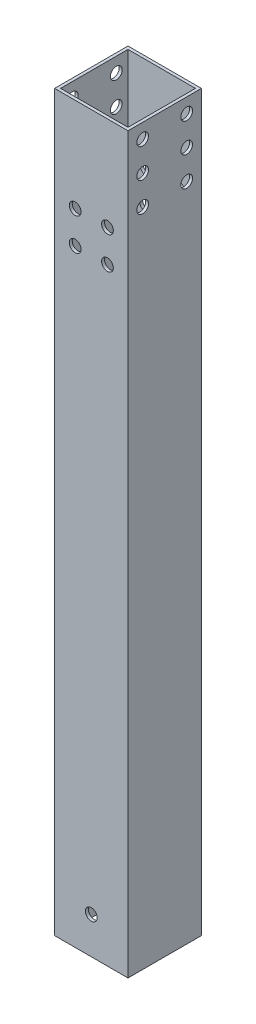
ISO-10303-21;
HEADER;
FILE_DESCRIPTION(('STEP AP214'),'2;1');
FILE_NAME('part.step','',(''),(''),'','','');
FILE_SCHEMA(('AUTOMOTIVE_DESIGN { 1 0 10303 214 1 1 1 1 }'));
ENDSEC;
DATA;
#1=APPLICATION_CONTEXT('core data for automotive mechanical design processes');
#2=APPLICATION_PROTOCOL_DEFINITION('international standard','automotive_design',2000,#1);
#3=PRODUCT_CONTEXT('',#1,'mechanical');
#4=PRODUCT('Part','Part','',(#3));
#5=PRODUCT_RELATED_PRODUCT_CATEGORY('part','',(#4));
#6=PRODUCT_DEFINITION_FORMATION('','',#4);
#7=PRODUCT_DEFINITION_CONTEXT('part definition',#1,'design');
#8=PRODUCT_DEFINITION('design','',#6,#7);
#9=PRODUCT_DEFINITION_SHAPE('','',#8);
#10=(LENGTH_UNIT() NAMED_UNIT(*) SI_UNIT(.MILLI.,.METRE.));
#11=(NAMED_UNIT(*) PLANE_ANGLE_UNIT() SI_UNIT($,.RADIAN.));
#12=(NAMED_UNIT(*) SI_UNIT($,.STERADIAN.) SOLID_ANGLE_UNIT());
#13=UNCERTAINTY_MEASURE_WITH_UNIT(LENGTH_MEASURE(1.E-05),#10,'distance_accuracy_value','');
#14=(GEOMETRIC_REPRESENTATION_CONTEXT(3) GLOBAL_UNCERTAINTY_ASSIGNED_CONTEXT((#13)) GLOBAL_UNIT_ASSIGNED_CONTEXT((#10,
#11,#12)) REPRESENTATION_CONTEXT('',''));
#15=CARTESIAN_POINT('',(0.,0.,0.));
#16=DIRECTION('',(0.,0.,1.));
#17=DIRECTION('',(1.,0.,0.));
#18=AXIS2_PLACEMENT_3D('',#15,#16,#17);
#19=CARTESIAN_POINT('',(0.,250.,0.));
#20=DIRECTION('',(0.,1.,0.));
#21=DIRECTION('',(0.,0.,1.));
#22=AXIS2_PLACEMENT_3D('',#19,#20,#21);
#23=PLANE('',#22);
#24=DIRECTION('',(0.,0.,-1.));
#25=VECTOR('',#24,1.);
#26=CARTESIAN_POINT('',(12.5,250.,-12.5));
#27=LINE('',#26,#25);
#28=CARTESIAN_POINT('',(12.5,250.,12.5));
#29=VERTEX_POINT('',#28);
#30=CARTESIAN_POINT('',(12.5,250.,-12.5));
#31=VERTEX_POINT('',#30);
#32=EDGE_CURVE('E138',#29,#31,#27,.T.);
#33=ORIENTED_EDGE('',*,*,#32,.T.);
#34=DIRECTION('',(-1.,0.,0.));
#35=VECTOR('',#34,1.);
#36=CARTESIAN_POINT('',(-12.5,250.,-12.5));
#37=LINE('',#36,#35);
#38=CARTESIAN_POINT('',(-12.5,250.,-12.5));
#39=VERTEX_POINT('',#38);
#40=EDGE_CURVE('E141',#31,#39,#37,.T.);
#41=ORIENTED_EDGE('',*,*,#40,.T.);
#42=DIRECTION('',(0.,0.,1.));
#43=VECTOR('',#42,1.);
#44=CARTESIAN_POINT('',(-12.5,250.,-12.5));
#45=LINE('',#44,#43);
#46=CARTESIAN_POINT('',(-12.5,250.,12.5));
#47=VERTEX_POINT('',#46);
#48=EDGE_CURVE('E144',#39,#47,#45,.T.);
#49=ORIENTED_EDGE('',*,*,#48,.T.);
#50=DIRECTION('',(1.,0.,0.));
#51=VECTOR('',#50,1.);
#52=CARTESIAN_POINT('',(-12.5,250.,12.5));
#53=LINE('',#52,#51);
#54=EDGE_CURVE('E146',#47,#29,#53,.T.);
#55=ORIENTED_EDGE('',*,*,#54,.T.);
#56=EDGE_LOOP('',(#33,#41,#49,#55));
#57=FACE_BOUND('',#56,.T.);
#58=DIRECTION('',(1.,0.,0.));
#59=VECTOR('',#58,1.);
#60=CARTESIAN_POINT('',(-11.5,250.,11.5));
#61=LINE('',#60,#59);
#62=CARTESIAN_POINT('',(-11.5,250.,11.5));
#63=VERTEX_POINT('',#62);
#64=CARTESIAN_POINT('',(11.5,250.,11.5));
#65=VERTEX_POINT('',#64);
#66=EDGE_CURVE('E108',#63,#65,#61,.T.);
#67=ORIENTED_EDGE('',*,*,#66,.F.);
#68=DIRECTION('',(0.,0.,1.));
#69=VECTOR('',#68,1.);
#70=CARTESIAN_POINT('',(-11.5,250.,-11.5));
#71=LINE('',#70,#69);
#72=CARTESIAN_POINT('',(-11.5,250.,-11.5));
#73=VERTEX_POINT('',#72);
#74=EDGE_CURVE('E100',#73,#63,#71,.T.);
#75=ORIENTED_EDGE('',*,*,#74,.F.);
#76=DIRECTION('',(-1.,0.,0.));
#77=VECTOR('',#76,1.);
#78=CARTESIAN_POINT('',(-11.5,250.,-11.5));
#79=LINE('',#78,#77);
#80=CARTESIAN_POINT('',(11.5,250.,-11.5));
#81=VERTEX_POINT('',#80);
#82=EDGE_CURVE('E122',#81,#73,#79,.T.);
#83=ORIENTED_EDGE('',*,*,#82,.F.);
#84=DIRECTION('',(0.,0.,-1.));
#85=VECTOR('',#84,1.);
#86=CARTESIAN_POINT('',(11.5,250.,-11.5));
#87=LINE('',#86,#85);
#88=EDGE_CURVE('E120',#65,#81,#87,.T.);
#89=ORIENTED_EDGE('',*,*,#88,.F.);
#90=EDGE_LOOP('',(#67,#75,#83,#89));
#91=FACE_BOUND('',#90,.T.);
#92=ADVANCED_FACE('F33',(#57,#91),#23,.T.);
#93=CARTESIAN_POINT('',(0.,0.,0.));
#94=DIRECTION('',(0.,1.,0.));
#95=DIRECTION('',(0.,0.,1.));
#96=AXIS2_PLACEMENT_3D('',#93,#94,#95);
#97=PLANE('',#96);
#98=DIRECTION('',(0.,0.,-1.));
#99=VECTOR('',#98,1.);
#100=CARTESIAN_POINT('',(12.5,0.,-12.5));
#101=LINE('',#100,#99);
#102=CARTESIAN_POINT('',(12.5,0.,12.5));
#103=VERTEX_POINT('',#102);
#104=CARTESIAN_POINT('',(12.5,0.,-12.5));
#105=VERTEX_POINT('',#104);
#106=EDGE_CURVE('E116',#103,#105,#101,.T.);
#107=ORIENTED_EDGE('',*,*,#106,.F.);
#108=DIRECTION('',(1.,0.,0.));
#109=VECTOR('',#108,1.);
#110=CARTESIAN_POINT('',(-12.5,0.,12.5));
#111=LINE('',#110,#109);
#112=CARTESIAN_POINT('',(-12.5,0.,12.5));
#113=VERTEX_POINT('',#112);
#114=EDGE_CURVE('E142',#113,#103,#111,.T.);
#115=ORIENTED_EDGE('',*,*,#114,.F.);
#116=DIRECTION('',(0.,0.,1.));
#117=VECTOR('',#116,1.);
#118=CARTESIAN_POINT('',(-12.5,0.,-12.5));
#119=LINE('',#118,#117);
#120=CARTESIAN_POINT('',(-12.5,0.,-12.5));
#121=VERTEX_POINT('',#120);
#122=EDGE_CURVE('E153',#121,#113,#119,.T.);
#123=ORIENTED_EDGE('',*,*,#122,.F.);
#124=DIRECTION('',(-1.,0.,0.));
#125=VECTOR('',#124,1.);
#126=CARTESIAN_POINT('',(-12.5,0.,-12.5));
#127=LINE('',#126,#125);
#128=EDGE_CURVE('E151',#105,#121,#127,.T.);
#129=ORIENTED_EDGE('',*,*,#128,.F.);
#130=EDGE_LOOP('',(#107,#115,#123,#129));
#131=FACE_BOUND('',#130,.T.);
#132=DIRECTION('',(0.,0.,1.));
#133=VECTOR('',#132,1.);
#134=CARTESIAN_POINT('',(-11.5,0.,-11.5));
#135=LINE('',#134,#133);
#136=CARTESIAN_POINT('',(-11.5,0.,-11.5));
#137=VERTEX_POINT('',#136);
#138=CARTESIAN_POINT('',(-11.5,0.,11.5));
#139=VERTEX_POINT('',#138);
#140=EDGE_CURVE('E58',#137,#139,#135,.T.);
#141=ORIENTED_EDGE('',*,*,#140,.T.);
#142=DIRECTION('',(1.,0.,0.));
#143=VECTOR('',#142,1.);
#144=CARTESIAN_POINT('',(-11.5,0.,11.5));
#145=LINE('',#144,#143);
#146=CARTESIAN_POINT('',(11.5,0.,11.5));
#147=VERTEX_POINT('',#146);
#148=EDGE_CURVE('E115',#139,#147,#145,.T.);
#149=ORIENTED_EDGE('',*,*,#148,.T.);
#150=DIRECTION('',(0.,0.,-1.));
#151=VECTOR('',#150,1.);
#152=CARTESIAN_POINT('',(11.5,0.,-11.5));
#153=LINE('',#152,#151);
#154=CARTESIAN_POINT('',(11.5,0.,-11.5));
#155=VERTEX_POINT('',#154);
#156=EDGE_CURVE('E130',#147,#155,#153,.T.);
#157=ORIENTED_EDGE('',*,*,#156,.T.);
#158=DIRECTION('',(-1.,0.,0.));
#159=VECTOR('',#158,1.);
#160=CARTESIAN_POINT('',(-11.5,0.,-11.5));
#161=LINE('',#160,#159);
#162=EDGE_CURVE('E109',#155,#137,#161,.T.);
#163=ORIENTED_EDGE('',*,*,#162,.T.);
#164=EDGE_LOOP('',(#141,#149,#157,#163));
#165=FACE_BOUND('',#164,.T.);
#166=ADVANCED_FACE('F336',(#131,#165),#97,.F.);
#167=CARTESIAN_POINT('',(12.5,250.,-12.5));
#168=DIRECTION('',(-1.,0.,0.));
#169=DIRECTION('',(0.,0.,1.));
#170=AXIS2_PLACEMENT_3D('',#167,#168,#169);
#171=PLANE('',#170);
#172=CARTESIAN_POINT('',(12.5,235.,-7.5));
#173=DIRECTION('',(1.,0.,0.));
#174=DIRECTION('',(0.,0.,-1.));
#175=AXIS2_PLACEMENT_3D('',#172,#173,#174);
#176=CIRCLE('',#175,2.);
#177=CARTESIAN_POINT('',(12.5,235.,-9.5));
#178=VERTEX_POINT('',#177);
#179=EDGE_CURVE('E258',#178,#178,#176,.T.);
#180=ORIENTED_EDGE('',*,*,#179,.F.);
#181=EDGE_LOOP('',(#180));
#182=FACE_BOUND('',#181,.T.);
#183=CARTESIAN_POINT('',(12.5,225.,-7.5));
#184=DIRECTION('',(1.,0.,0.));
#185=DIRECTION('',(0.,0.,-1.));
#186=AXIS2_PLACEMENT_3D('',#183,#184,#185);
#187=CIRCLE('',#186,2.);
#188=CARTESIAN_POINT('',(12.5,225.,-9.5));
#189=VERTEX_POINT('',#188);
#190=EDGE_CURVE('E264',#189,#189,#187,.T.);
#191=ORIENTED_EDGE('',*,*,#190,.F.);
#192=EDGE_LOOP('',(#191));
#193=FACE_BOUND('',#192,.T.);
#194=CARTESIAN_POINT('',(12.5,245.,7.5));
#195=DIRECTION('',(1.,0.,0.));
#196=DIRECTION('',(0.,0.,-1.));
#197=AXIS2_PLACEMENT_3D('',#194,#195,#196);
#198=CIRCLE('',#197,2.);
#199=CARTESIAN_POINT('',(12.5,245.,5.5));
#200=VERTEX_POINT('',#199);
#201=EDGE_CURVE('E270',#200,#200,#198,.T.);
#202=ORIENTED_EDGE('',*,*,#201,.F.);
#203=EDGE_LOOP('',(#202));
#204=FACE_BOUND('',#203,.T.);
#205=CARTESIAN_POINT('',(12.5,235.,7.5));
#206=DIRECTION('',(1.,0.,0.));
#207=DIRECTION('',(0.,0.,-1.));
#208=AXIS2_PLACEMENT_3D('',#205,#206,#207);
#209=CIRCLE('',#208,2.);
#210=CARTESIAN_POINT('',(12.5,235.,5.5));
#211=VERTEX_POINT('',#210);
#212=EDGE_CURVE('E251',#211,#211,#209,.T.);
#213=ORIENTED_EDGE('',*,*,#212,.F.);
#214=EDGE_LOOP('',(#213));
#215=FACE_BOUND('',#214,.T.);
#216=CARTESIAN_POINT('',(12.5,225.,7.5));
#217=DIRECTION('',(1.,0.,0.));
#218=DIRECTION('',(0.,0.,-1.));
#219=AXIS2_PLACEMENT_3D('',#216,#217,#218);
#220=CIRCLE('',#219,2.);
#221=CARTESIAN_POINT('',(12.5,225.,5.5));
#222=VERTEX_POINT('',#221);
#223=EDGE_CURVE('E247',#222,#222,#220,.T.);
#224=ORIENTED_EDGE('',*,*,#223,.F.);
#225=EDGE_LOOP('',(#224));
#226=FACE_BOUND('',#225,.T.);
#227=CARTESIAN_POINT('',(12.5,245.,-7.5));
#228=DIRECTION('',(1.,0.,0.));
#229=DIRECTION('',(0.,0.,-1.));
#230=AXIS2_PLACEMENT_3D('',#227,#228,#229);
#231=CIRCLE('',#230,2.);
#232=CARTESIAN_POINT('',(12.5,245.,-9.5));
#233=VERTEX_POINT('',#232);
#234=EDGE_CURVE('E257',#233,#233,#231,.T.);
#235=ORIENTED_EDGE('',*,*,#234,.F.);
#236=EDGE_LOOP('',(#235));
#237=FACE_BOUND('',#236,.T.);
#238=ORIENTED_EDGE('',*,*,#106,.T.);
#239=DIRECTION('',(0.,-1.,0.));
#240=VECTOR('',#239,1.);
#241=CARTESIAN_POINT('',(12.5,250.,-12.5));
#242=LINE('',#241,#240);
#243=EDGE_CURVE('E11',#31,#105,#242,.T.);
#244=ORIENTED_EDGE('',*,*,#243,.F.);
#245=ORIENTED_EDGE('',*,*,#32,.F.);
#246=DIRECTION('',(0.,-1.,0.));
#247=VECTOR('',#246,1.);
#248=CARTESIAN_POINT('',(12.5,250.,12.5));
#249=LINE('',#248,#247);
#250=EDGE_CURVE('E148',#29,#103,#249,.T.);
#251=ORIENTED_EDGE('',*,*,#250,.T.);
#252=EDGE_LOOP('',(#238,#244,#245,#251));
#253=FACE_BOUND('',#252,.T.);
#254=ADVANCED_FACE('F35',(#182,#193,#204,#215,#226,#237,#253),#171,.F.);
#255=CARTESIAN_POINT('',(-12.5,250.,-12.5));
#256=DIRECTION('',(0.,0.,1.));
#257=DIRECTION('',(1.,0.,0.));
#258=AXIS2_PLACEMENT_3D('',#255,#256,#257);
#259=PLANE('',#258);
#260=CARTESIAN_POINT('',(-5.50000000000001,218.,-12.5));
#261=DIRECTION('',(0.,0.,-1.));
#262=DIRECTION('',(-1.,0.,0.));
#263=AXIS2_PLACEMENT_3D('',#260,#261,#262);
#264=CIRCLE('',#263,2.);
#265=CARTESIAN_POINT('',(-7.50000000000001,218.,-12.5));
#266=VERTEX_POINT('',#265);
#267=EDGE_CURVE('E203',#266,#266,#264,.T.);
#268=ORIENTED_EDGE('',*,*,#267,.F.);
#269=EDGE_LOOP('',(#268));
#270=FACE_BOUND('',#269,.T.);
#271=CARTESIAN_POINT('',(-5.50000000000001,207.,-12.5));
#272=DIRECTION('',(0.,0.,-1.));
#273=DIRECTION('',(-1.,0.,0.));
#274=AXIS2_PLACEMENT_3D('',#271,#272,#273);
#275=CIRCLE('',#274,2.);
#276=CARTESIAN_POINT('',(-7.50000000000001,207.,-12.5));
#277=VERTEX_POINT('',#276);
#278=EDGE_CURVE('E214',#277,#277,#275,.T.);
#279=ORIENTED_EDGE('',*,*,#278,.F.);
#280=EDGE_LOOP('',(#279));
#281=FACE_BOUND('',#280,.T.);
#282=CARTESIAN_POINT('',(0.,12.5,-12.5));
#283=DIRECTION('',(0.,0.,1.));
#284=DIRECTION('',(1.,0.,0.));
#285=AXIS2_PLACEMENT_3D('',#282,#283,#284);
#286=CIRCLE('',#285,2.);
#287=CARTESIAN_POINT('',(2.,12.5,-12.5));
#288=VERTEX_POINT('',#287);
#289=EDGE_CURVE('E199',#288,#288,#286,.T.);
#290=ORIENTED_EDGE('',*,*,#289,.T.);
#291=EDGE_LOOP('',(#290));
#292=FACE_BOUND('',#291,.T.);
#293=CARTESIAN_POINT('',(5.50000000000001,218.,-12.5));
#294=DIRECTION('',(0.,0.,1.));
#295=DIRECTION('',(1.,0.,0.));
#296=AXIS2_PLACEMENT_3D('',#293,#294,#295);
#297=CIRCLE('',#296,2.);
#298=CARTESIAN_POINT('',(7.50000000000001,218.,-12.5));
#299=VERTEX_POINT('',#298);
#300=EDGE_CURVE('E191',#299,#299,#297,.T.);
#301=ORIENTED_EDGE('',*,*,#300,.T.);
#302=EDGE_LOOP('',(#301));
#303=FACE_BOUND('',#302,.T.);
#304=CARTESIAN_POINT('',(5.50000000000001,207.,-12.5));
#305=DIRECTION('',(0.,0.,1.));
#306=DIRECTION('',(1.,0.,0.));
#307=AXIS2_PLACEMENT_3D('',#304,#305,#306);
#308=CIRCLE('',#307,2.);
#309=CARTESIAN_POINT('',(7.50000000000001,207.,-12.5));
#310=VERTEX_POINT('',#309);
#311=EDGE_CURVE('E238',#310,#310,#308,.T.);
#312=ORIENTED_EDGE('',*,*,#311,.T.);
#313=EDGE_LOOP('',(#312));
#314=FACE_BOUND('',#313,.T.);
#315=ORIENTED_EDGE('',*,*,#128,.T.);
#316=DIRECTION('',(0.,-1.,0.));
#317=VECTOR('',#316,1.);
#318=CARTESIAN_POINT('',(-12.5,250.,-12.5));
#319=LINE('',#318,#317);
#320=EDGE_CURVE('E42',#39,#121,#319,.T.);
#321=ORIENTED_EDGE('',*,*,#320,.F.);
#322=ORIENTED_EDGE('',*,*,#40,.F.);
#323=ORIENTED_EDGE('',*,*,#243,.T.);
#324=EDGE_LOOP('',(#315,#321,#322,#323));
#325=FACE_BOUND('',#324,.T.);
#326=ADVANCED_FACE('F323',(#270,#281,#292,#303,#314,#325),#259,.F.);
#327=CARTESIAN_POINT('',(-12.5,250.,-12.5));
#328=DIRECTION('',(1.,0.,0.));
#329=DIRECTION('',(0.,0.,-1.));
#330=AXIS2_PLACEMENT_3D('',#327,#328,#329);
#331=PLANE('',#330);
#332=CARTESIAN_POINT('',(-12.5,235.,-7.5));
#333=DIRECTION('',(1.,0.,0.));
#334=DIRECTION('',(0.,0.,-1.));
#335=AXIS2_PLACEMENT_3D('',#332,#333,#334);
#336=CIRCLE('',#335,2.);
#337=CARTESIAN_POINT('',(-12.5,235.,-9.5));
#338=VERTEX_POINT('',#337);
#339=EDGE_CURVE('E254',#338,#338,#336,.T.);
#340=ORIENTED_EDGE('',*,*,#339,.T.);
#341=EDGE_LOOP('',(#340));
#342=FACE_BOUND('',#341,.T.);
#343=CARTESIAN_POINT('',(-12.5,225.,-7.5));
#344=DIRECTION('',(1.,0.,0.));
#345=DIRECTION('',(0.,0.,-1.));
#346=AXIS2_PLACEMENT_3D('',#343,#344,#345);
#347=CIRCLE('',#346,2.);
#348=CARTESIAN_POINT('',(-12.5,225.,-9.5));
#349=VERTEX_POINT('',#348);
#350=EDGE_CURVE('E261',#349,#349,#347,.T.);
#351=ORIENTED_EDGE('',*,*,#350,.T.);
#352=EDGE_LOOP('',(#351));
#353=FACE_BOUND('',#352,.T.);
#354=CARTESIAN_POINT('',(-12.5,245.,7.5));
#355=DIRECTION('',(1.,0.,0.));
#356=DIRECTION('',(0.,0.,-1.));
#357=AXIS2_PLACEMENT_3D('',#354,#355,#356);
#358=CIRCLE('',#357,2.);
#359=CARTESIAN_POINT('',(-12.5,245.,5.5));
#360=VERTEX_POINT('',#359);
#361=EDGE_CURVE('E267',#360,#360,#358,.T.);
#362=ORIENTED_EDGE('',*,*,#361,.T.);
#363=EDGE_LOOP('',(#362));
#364=FACE_BOUND('',#363,.T.);
#365=CARTESIAN_POINT('',(-12.5,235.,7.5));
#366=DIRECTION('',(1.,0.,0.));
#367=DIRECTION('',(0.,0.,-1.));
#368=AXIS2_PLACEMENT_3D('',#365,#366,#367);
#369=CIRCLE('',#368,2.);
#370=CARTESIAN_POINT('',(-12.5,235.,5.5));
#371=VERTEX_POINT('',#370);
#372=EDGE_CURVE('E273',#371,#371,#369,.T.);
#373=ORIENTED_EDGE('',*,*,#372,.T.);
#374=EDGE_LOOP('',(#373));
#375=FACE_BOUND('',#374,.T.);
#376=CARTESIAN_POINT('',(-12.5,225.,7.5));
#377=DIRECTION('',(1.,0.,0.));
#378=DIRECTION('',(0.,0.,-1.));
#379=AXIS2_PLACEMENT_3D('',#376,#377,#378);
#380=CIRCLE('',#379,2.);
#381=CARTESIAN_POINT('',(-12.5,225.,5.5));
#382=VERTEX_POINT('',#381);
#383=EDGE_CURVE('E248',#382,#382,#380,.T.);
#384=ORIENTED_EDGE('',*,*,#383,.T.);
#385=EDGE_LOOP('',(#384));
#386=FACE_BOUND('',#385,.T.);
#387=CARTESIAN_POINT('',(-12.5,245.,-7.5));
#388=DIRECTION('',(1.,0.,0.));
#389=DIRECTION('',(0.,0.,-1.));
#390=AXIS2_PLACEMENT_3D('',#387,#388,#389);
#391=CIRCLE('',#390,2.);
#392=CARTESIAN_POINT('',(-12.5,245.,-9.5));
#393=VERTEX_POINT('',#392);
#394=EDGE_CURVE('E167',#393,#393,#391,.T.);
#395=ORIENTED_EDGE('',*,*,#394,.T.);
#396=EDGE_LOOP('',(#395));
#397=FACE_BOUND('',#396,.T.);
#398=ORIENTED_EDGE('',*,*,#122,.T.);
#399=DIRECTION('',(0.,-1.,0.));
#400=VECTOR('',#399,1.);
#401=CARTESIAN_POINT('',(-12.5,250.,12.5));
#402=LINE('',#401,#400);
#403=EDGE_CURVE('E158',#47,#113,#402,.T.);
#404=ORIENTED_EDGE('',*,*,#403,.F.);
#405=ORIENTED_EDGE('',*,*,#48,.F.);
#406=ORIENTED_EDGE('',*,*,#320,.T.);
#407=EDGE_LOOP('',(#398,#404,#405,#406));
#408=FACE_BOUND('',#407,.T.);
#409=ADVANCED_FACE('F320',(#342,#353,#364,#375,#386,#397,#408),#331,.F.);
#410=CARTESIAN_POINT('',(-12.5,250.,12.5));
#411=DIRECTION('',(0.,0.,-1.));
#412=DIRECTION('',(-1.,0.,0.));
#413=AXIS2_PLACEMENT_3D('',#410,#411,#412);
#414=PLANE('',#413);
#415=CARTESIAN_POINT('',(-5.50000000000001,218.,12.5));
#416=DIRECTION('',(0.,0.,-1.));
#417=DIRECTION('',(-1.,0.,0.));
#418=AXIS2_PLACEMENT_3D('',#415,#416,#417);
#419=CIRCLE('',#418,2.);
#420=CARTESIAN_POINT('',(-7.50000000000001,218.,12.5));
#421=VERTEX_POINT('',#420);
#422=EDGE_CURVE('E209',#421,#421,#419,.T.);
#423=ORIENTED_EDGE('',*,*,#422,.T.);
#424=EDGE_LOOP('',(#423));
#425=FACE_BOUND('',#424,.T.);
#426=CARTESIAN_POINT('',(-5.50000000000001,207.,12.5));
#427=DIRECTION('',(0.,0.,-1.));
#428=DIRECTION('',(-1.,0.,0.));
#429=AXIS2_PLACEMENT_3D('',#426,#427,#428);
#430=CIRCLE('',#429,2.);
#431=CARTESIAN_POINT('',(-7.50000000000001,207.,12.5));
#432=VERTEX_POINT('',#431);
#433=EDGE_CURVE('E219',#432,#432,#430,.T.);
#434=ORIENTED_EDGE('',*,*,#433,.T.);
#435=EDGE_LOOP('',(#434));
#436=FACE_BOUND('',#435,.T.);
#437=CARTESIAN_POINT('',(0.,12.5,12.5));
#438=DIRECTION('',(0.,0.,1.));
#439=DIRECTION('',(1.,0.,0.));
#440=AXIS2_PLACEMENT_3D('',#437,#438,#439);
#441=CIRCLE('',#440,2.);
#442=CARTESIAN_POINT('',(2.,12.5,12.5));
#443=VERTEX_POINT('',#442);
#444=EDGE_CURVE('E225',#443,#443,#441,.T.);
#445=ORIENTED_EDGE('',*,*,#444,.F.);
#446=EDGE_LOOP('',(#445));
#447=FACE_BOUND('',#446,.T.);
#448=CARTESIAN_POINT('',(5.50000000000001,218.,12.5));
#449=DIRECTION('',(0.,0.,1.));
#450=DIRECTION('',(1.,0.,0.));
#451=AXIS2_PLACEMENT_3D('',#448,#449,#450);
#452=CIRCLE('',#451,2.);
#453=CARTESIAN_POINT('',(7.50000000000001,218.,12.5));
#454=VERTEX_POINT('',#453);
#455=EDGE_CURVE('E235',#454,#454,#452,.T.);
#456=ORIENTED_EDGE('',*,*,#455,.F.);
#457=EDGE_LOOP('',(#456));
#458=FACE_BOUND('',#457,.T.);
#459=CARTESIAN_POINT('',(5.50000000000001,207.,12.5));
#460=DIRECTION('',(0.,0.,1.));
#461=DIRECTION('',(1.,0.,0.));
#462=AXIS2_PLACEMENT_3D('',#459,#460,#461);
#463=CIRCLE('',#462,2.);
#464=CARTESIAN_POINT('',(7.50000000000001,207.,12.5));
#465=VERTEX_POINT('',#464);
#466=EDGE_CURVE('E232',#465,#465,#463,.T.);
#467=ORIENTED_EDGE('',*,*,#466,.F.);
#468=EDGE_LOOP('',(#467));
#469=FACE_BOUND('',#468,.T.);
#470=ORIENTED_EDGE('',*,*,#114,.T.);
#471=ORIENTED_EDGE('',*,*,#250,.F.);
#472=ORIENTED_EDGE('',*,*,#54,.F.);
#473=ORIENTED_EDGE('',*,*,#403,.T.);
#474=EDGE_LOOP('',(#470,#471,#472,#473));
#475=FACE_BOUND('',#474,.T.);
#476=ADVANCED_FACE('F299',(#425,#436,#447,#458,#469,#475),#414,.F.);
#477=CARTESIAN_POINT('',(-11.5,250.,-11.5));
#478=DIRECTION('',(1.,0.,0.));
#479=DIRECTION('',(0.,0.,-1.));
#480=AXIS2_PLACEMENT_3D('',#477,#478,#479);
#481=PLANE('',#480);
#482=CARTESIAN_POINT('',(-11.5,235.,-7.5));
#483=DIRECTION('',(1.,0.,0.));
#484=DIRECTION('',(0.,0.,-1.));
#485=AXIS2_PLACEMENT_3D('',#482,#483,#484);
#486=CIRCLE('',#485,2.);
#487=CARTESIAN_POINT('',(-11.5,235.,-9.5));
#488=VERTEX_POINT('',#487);
#489=EDGE_CURVE('E128',#488,#488,#486,.T.);
#490=ORIENTED_EDGE('',*,*,#489,.F.);
#491=EDGE_LOOP('',(#490));
#492=FACE_BOUND('',#491,.T.);
#493=CARTESIAN_POINT('',(-11.5,225.,-7.5));
#494=DIRECTION('',(1.,0.,0.));
#495=DIRECTION('',(0.,0.,-1.));
#496=AXIS2_PLACEMENT_3D('',#493,#494,#495);
#497=CIRCLE('',#496,2.);
#498=CARTESIAN_POINT('',(-11.5,225.,-9.5));
#499=VERTEX_POINT('',#498);
#500=EDGE_CURVE('E183',#499,#499,#497,.T.);
#501=ORIENTED_EDGE('',*,*,#500,.F.);
#502=EDGE_LOOP('',(#501));
#503=FACE_BOUND('',#502,.T.);
#504=CARTESIAN_POINT('',(-11.5,245.,7.5));
#505=DIRECTION('',(1.,0.,0.));
#506=DIRECTION('',(0.,0.,-1.));
#507=AXIS2_PLACEMENT_3D('',#504,#505,#506);
#508=CIRCLE('',#507,2.);
#509=CARTESIAN_POINT('',(-11.5,245.,5.5));
#510=VERTEX_POINT('',#509);
#511=EDGE_CURVE('E179',#510,#510,#508,.T.);
#512=ORIENTED_EDGE('',*,*,#511,.F.);
#513=EDGE_LOOP('',(#512));
#514=FACE_BOUND('',#513,.T.);
#515=CARTESIAN_POINT('',(-11.5,235.,7.5));
#516=DIRECTION('',(1.,0.,0.));
#517=DIRECTION('',(0.,0.,-1.));
#518=AXIS2_PLACEMENT_3D('',#515,#516,#517);
#519=CIRCLE('',#518,2.);
#520=CARTESIAN_POINT('',(-11.5,235.,5.5));
#521=VERTEX_POINT('',#520);
#522=EDGE_CURVE('E175',#521,#521,#519,.T.);
#523=ORIENTED_EDGE('',*,*,#522,.F.);
#524=EDGE_LOOP('',(#523));
#525=FACE_BOUND('',#524,.T.);
#526=CARTESIAN_POINT('',(-11.5,225.,7.5));
#527=DIRECTION('',(1.,0.,0.));
#528=DIRECTION('',(0.,0.,-1.));
#529=AXIS2_PLACEMENT_3D('',#526,#527,#528);
#530=CIRCLE('',#529,2.);
#531=CARTESIAN_POINT('',(-11.5,225.,5.5));
#532=VERTEX_POINT('',#531);
#533=EDGE_CURVE('E171',#532,#532,#530,.T.);
#534=ORIENTED_EDGE('',*,*,#533,.F.);
#535=EDGE_LOOP('',(#534));
#536=FACE_BOUND('',#535,.T.);
#537=CARTESIAN_POINT('',(-11.5,245.,-7.5));
#538=DIRECTION('',(1.,0.,0.));
#539=DIRECTION('',(0.,0.,-1.));
#540=AXIS2_PLACEMENT_3D('',#537,#538,#539);
#541=CIRCLE('',#540,2.);
#542=CARTESIAN_POINT('',(-11.5,245.,-9.5));
#543=VERTEX_POINT('',#542);
#544=EDGE_CURVE('E166',#543,#543,#541,.T.);
#545=ORIENTED_EDGE('',*,*,#544,.F.);
#546=EDGE_LOOP('',(#545));
#547=FACE_BOUND('',#546,.T.);
#548=ORIENTED_EDGE('',*,*,#140,.F.);
#549=DIRECTION('',(0.,-1.,0.));
#550=VECTOR('',#549,1.);
#551=CARTESIAN_POINT('',(-11.5,250.,-11.5));
#552=LINE('',#551,#550);
#553=EDGE_CURVE('E104',#73,#137,#552,.T.);
#554=ORIENTED_EDGE('',*,*,#553,.F.);
#555=ORIENTED_EDGE('',*,*,#74,.T.);
#556=DIRECTION('',(0.,-1.,0.));
#557=VECTOR('',#556,1.);
#558=CARTESIAN_POINT('',(-11.5,250.,11.5));
#559=LINE('',#558,#557);
#560=EDGE_CURVE('E103',#63,#139,#559,.T.);
#561=ORIENTED_EDGE('',*,*,#560,.T.);
#562=EDGE_LOOP('',(#548,#554,#555,#561));
#563=FACE_BOUND('',#562,.T.);
#564=ADVANCED_FACE('F102',(#492,#503,#514,#525,#536,#547,#563),#481,.T.);
#565=CARTESIAN_POINT('',(-11.5,250.,11.5));
#566=DIRECTION('',(0.,0.,-1.));
#567=DIRECTION('',(-1.,0.,0.));
#568=AXIS2_PLACEMENT_3D('',#565,#566,#567);
#569=PLANE('',#568);
#570=CARTESIAN_POINT('',(-5.50000000000001,218.,11.5));
#571=DIRECTION('',(0.,0.,-1.));
#572=DIRECTION('',(-1.,0.,0.));
#573=AXIS2_PLACEMENT_3D('',#570,#571,#572);
#574=CIRCLE('',#573,2.);
#575=CARTESIAN_POINT('',(-7.50000000000001,218.,11.5));
#576=VERTEX_POINT('',#575);
#577=EDGE_CURVE('E222',#576,#576,#574,.F.);
#578=ORIENTED_EDGE('',*,*,#577,.T.);
#579=EDGE_LOOP('',(#578));
#580=FACE_BOUND('',#579,.T.);
#581=CARTESIAN_POINT('',(-5.50000000000001,207.,11.5));
#582=DIRECTION('',(0.,0.,-1.));
#583=DIRECTION('',(-1.,0.,0.));
#584=AXIS2_PLACEMENT_3D('',#581,#582,#583);
#585=CIRCLE('',#584,2.);
#586=CARTESIAN_POINT('',(-7.50000000000001,207.,11.5));
#587=VERTEX_POINT('',#586);
#588=EDGE_CURVE('E202',#587,#587,#585,.F.);
#589=ORIENTED_EDGE('',*,*,#588,.T.);
#590=EDGE_LOOP('',(#589));
#591=FACE_BOUND('',#590,.T.);
#592=CARTESIAN_POINT('',(0.,12.5,11.5));
#593=DIRECTION('',(0.,0.,-1.));
#594=DIRECTION('',(-1.,0.,0.));
#595=AXIS2_PLACEMENT_3D('',#592,#593,#594);
#596=CIRCLE('',#595,2.);
#597=CARTESIAN_POINT('',(-2.,12.5,11.5));
#598=VERTEX_POINT('',#597);
#599=EDGE_CURVE('E198',#598,#598,#596,.T.);
#600=ORIENTED_EDGE('',*,*,#599,.F.);
#601=EDGE_LOOP('',(#600));
#602=FACE_BOUND('',#601,.T.);
#603=CARTESIAN_POINT('',(5.50000000000001,218.,11.5));
#604=DIRECTION('',(0.,0.,-1.));
#605=DIRECTION('',(-1.,0.,0.));
#606=AXIS2_PLACEMENT_3D('',#603,#604,#605);
#607=CIRCLE('',#606,2.);
#608=CARTESIAN_POINT('',(3.5,218.,11.5));
#609=VERTEX_POINT('',#608);
#610=EDGE_CURVE('E195',#609,#609,#607,.T.);
#611=ORIENTED_EDGE('',*,*,#610,.F.);
#612=EDGE_LOOP('',(#611));
#613=FACE_BOUND('',#612,.T.);
#614=CARTESIAN_POINT('',(5.50000000000001,207.,11.5));
#615=DIRECTION('',(0.,0.,-1.));
#616=DIRECTION('',(-1.,0.,0.));
#617=AXIS2_PLACEMENT_3D('',#614,#615,#616);
#618=CIRCLE('',#617,2.);
#619=CARTESIAN_POINT('',(3.5,207.,11.5));
#620=VERTEX_POINT('',#619);
#621=EDGE_CURVE('E190',#620,#620,#618,.T.);
#622=ORIENTED_EDGE('',*,*,#621,.F.);
#623=EDGE_LOOP('',(#622));
#624=FACE_BOUND('',#623,.T.);
#625=ORIENTED_EDGE('',*,*,#148,.F.);
#626=ORIENTED_EDGE('',*,*,#560,.F.);
#627=ORIENTED_EDGE('',*,*,#66,.T.);
#628=DIRECTION('',(0.,-1.,0.));
#629=VECTOR('',#628,1.);
#630=CARTESIAN_POINT('',(11.5,250.,11.5));
#631=LINE('',#630,#629);
#632=EDGE_CURVE('E117',#65,#147,#631,.T.);
#633=ORIENTED_EDGE('',*,*,#632,.T.);
#634=EDGE_LOOP('',(#625,#626,#627,#633));
#635=FACE_BOUND('',#634,.T.);
#636=ADVANCED_FACE('F112',(#580,#591,#602,#613,#624,#635),#569,.T.);
#637=CARTESIAN_POINT('',(11.5,250.,-11.5));
#638=DIRECTION('',(-1.,0.,0.));
#639=DIRECTION('',(0.,0.,1.));
#640=AXIS2_PLACEMENT_3D('',#637,#638,#639);
#641=PLANE('',#640);
#642=CARTESIAN_POINT('',(11.5,235.,-7.5));
#643=DIRECTION('',(-1.,0.,0.));
#644=DIRECTION('',(0.,0.,1.));
#645=AXIS2_PLACEMENT_3D('',#642,#643,#644);
#646=CIRCLE('',#645,2.);
#647=CARTESIAN_POINT('',(11.5,235.,-5.5));
#648=VERTEX_POINT('',#647);
#649=EDGE_CURVE('E184',#648,#648,#646,.T.);
#650=ORIENTED_EDGE('',*,*,#649,.F.);
#651=EDGE_LOOP('',(#650));
#652=FACE_BOUND('',#651,.T.);
#653=CARTESIAN_POINT('',(11.5,225.,-7.5));
#654=DIRECTION('',(-1.,0.,0.));
#655=DIRECTION('',(0.,0.,1.));
#656=AXIS2_PLACEMENT_3D('',#653,#654,#655);
#657=CIRCLE('',#656,2.);
#658=CARTESIAN_POINT('',(11.5,225.,-5.5));
#659=VERTEX_POINT('',#658);
#660=EDGE_CURVE('E180',#659,#659,#657,.T.);
#661=ORIENTED_EDGE('',*,*,#660,.F.);
#662=EDGE_LOOP('',(#661));
#663=FACE_BOUND('',#662,.T.);
#664=CARTESIAN_POINT('',(11.5,245.,7.5));
#665=DIRECTION('',(-1.,0.,0.));
#666=DIRECTION('',(0.,0.,1.));
#667=AXIS2_PLACEMENT_3D('',#664,#665,#666);
#668=CIRCLE('',#667,2.);
#669=CARTESIAN_POINT('',(11.5,245.,9.5));
#670=VERTEX_POINT('',#669);
#671=EDGE_CURVE('E176',#670,#670,#668,.T.);
#672=ORIENTED_EDGE('',*,*,#671,.F.);
#673=EDGE_LOOP('',(#672));
#674=FACE_BOUND('',#673,.T.);
#675=CARTESIAN_POINT('',(11.5,235.,7.5));
#676=DIRECTION('',(-1.,0.,0.));
#677=DIRECTION('',(0.,0.,1.));
#678=AXIS2_PLACEMENT_3D('',#675,#676,#677);
#679=CIRCLE('',#678,2.);
#680=CARTESIAN_POINT('',(11.5,235.,9.5));
#681=VERTEX_POINT('',#680);
#682=EDGE_CURVE('E172',#681,#681,#679,.T.);
#683=ORIENTED_EDGE('',*,*,#682,.F.);
#684=EDGE_LOOP('',(#683));
#685=FACE_BOUND('',#684,.T.);
#686=CARTESIAN_POINT('',(11.5,225.,7.5));
#687=DIRECTION('',(-1.,0.,0.));
#688=DIRECTION('',(0.,0.,1.));
#689=AXIS2_PLACEMENT_3D('',#686,#687,#688);
#690=CIRCLE('',#689,2.);
#691=CARTESIAN_POINT('',(11.5,225.,9.5));
#692=VERTEX_POINT('',#691);
#693=EDGE_CURVE('E168',#692,#692,#690,.T.);
#694=ORIENTED_EDGE('',*,*,#693,.F.);
#695=EDGE_LOOP('',(#694));
#696=FACE_BOUND('',#695,.T.);
#697=CARTESIAN_POINT('',(11.5,245.,-7.5));
#698=DIRECTION('',(-1.,0.,0.));
#699=DIRECTION('',(0.,0.,1.));
#700=AXIS2_PLACEMENT_3D('',#697,#698,#699);
#701=CIRCLE('',#700,2.);
#702=CARTESIAN_POINT('',(11.5,245.,-5.5));
#703=VERTEX_POINT('',#702);
#704=EDGE_CURVE('E163',#703,#703,#701,.T.);
#705=ORIENTED_EDGE('',*,*,#704,.F.);
#706=EDGE_LOOP('',(#705));
#707=FACE_BOUND('',#706,.T.);
#708=ORIENTED_EDGE('',*,*,#156,.F.);
#709=ORIENTED_EDGE('',*,*,#632,.F.);
#710=ORIENTED_EDGE('',*,*,#88,.T.);
#711=DIRECTION('',(0.,-1.,0.));
#712=VECTOR('',#711,1.);
#713=CARTESIAN_POINT('',(11.5,250.,-11.5));
#714=LINE('',#713,#712);
#715=EDGE_CURVE('E50',#81,#155,#714,.T.);
#716=ORIENTED_EDGE('',*,*,#715,.T.);
#717=EDGE_LOOP('',(#708,#709,#710,#716));
#718=FACE_BOUND('',#717,.T.);
#719=ADVANCED_FACE('F402',(#652,#663,#674,#685,#696,#707,#718),#641,.T.);
#720=CARTESIAN_POINT('',(-11.5,250.,-11.5));
#721=DIRECTION('',(0.,0.,1.));
#722=DIRECTION('',(1.,0.,0.));
#723=AXIS2_PLACEMENT_3D('',#720,#721,#722);
#724=PLANE('',#723);
#725=CARTESIAN_POINT('',(-5.50000000000001,218.,-11.5));
#726=DIRECTION('',(0.,0.,1.));
#727=DIRECTION('',(1.,0.,0.));
#728=AXIS2_PLACEMENT_3D('',#725,#726,#727);
#729=CIRCLE('',#728,2.);
#730=CARTESIAN_POINT('',(-3.5,218.,-11.5));
#731=VERTEX_POINT('',#730);
#732=EDGE_CURVE('E37',#731,#731,#729,.F.);
#733=ORIENTED_EDGE('',*,*,#732,.T.);
#734=EDGE_LOOP('',(#733));
#735=FACE_BOUND('',#734,.T.);
#736=CARTESIAN_POINT('',(-5.50000000000001,207.,-11.5));
#737=DIRECTION('',(0.,0.,1.));
#738=DIRECTION('',(1.,0.,0.));
#739=AXIS2_PLACEMENT_3D('',#736,#737,#738);
#740=CIRCLE('',#739,2.);
#741=CARTESIAN_POINT('',(-3.5,207.,-11.5));
#742=VERTEX_POINT('',#741);
#743=EDGE_CURVE('E200',#742,#742,#740,.F.);
#744=ORIENTED_EDGE('',*,*,#743,.T.);
#745=EDGE_LOOP('',(#744));
#746=FACE_BOUND('',#745,.T.);
#747=CARTESIAN_POINT('',(0.,12.5,-11.5));
#748=DIRECTION('',(0.,0.,1.));
#749=DIRECTION('',(1.,0.,0.));
#750=AXIS2_PLACEMENT_3D('',#747,#748,#749);
#751=CIRCLE('',#750,2.);
#752=CARTESIAN_POINT('',(2.,12.5,-11.5));
#753=VERTEX_POINT('',#752);
#754=EDGE_CURVE('E196',#753,#753,#751,.T.);
#755=ORIENTED_EDGE('',*,*,#754,.F.);
#756=EDGE_LOOP('',(#755));
#757=FACE_BOUND('',#756,.T.);
#758=CARTESIAN_POINT('',(5.50000000000001,218.,-11.5));
#759=DIRECTION('',(0.,0.,1.));
#760=DIRECTION('',(1.,0.,0.));
#761=AXIS2_PLACEMENT_3D('',#758,#759,#760);
#762=CIRCLE('',#761,2.);
#763=CARTESIAN_POINT('',(7.50000000000001,218.,-11.5));
#764=VERTEX_POINT('',#763);
#765=EDGE_CURVE('E192',#764,#764,#762,.T.);
#766=ORIENTED_EDGE('',*,*,#765,.F.);
#767=EDGE_LOOP('',(#766));
#768=FACE_BOUND('',#767,.T.);
#769=CARTESIAN_POINT('',(5.50000000000001,207.,-11.5));
#770=DIRECTION('',(0.,0.,1.));
#771=DIRECTION('',(1.,0.,0.));
#772=AXIS2_PLACEMENT_3D('',#769,#770,#771);
#773=CIRCLE('',#772,2.);
#774=CARTESIAN_POINT('',(7.50000000000001,207.,-11.5));
#775=VERTEX_POINT('',#774);
#776=EDGE_CURVE('E187',#775,#775,#773,.T.);
#777=ORIENTED_EDGE('',*,*,#776,.F.);
#778=EDGE_LOOP('',(#777));
#779=FACE_BOUND('',#778,.T.);
#780=ORIENTED_EDGE('',*,*,#162,.F.);
#781=ORIENTED_EDGE('',*,*,#715,.F.);
#782=ORIENTED_EDGE('',*,*,#82,.T.);
#783=ORIENTED_EDGE('',*,*,#553,.T.);
#784=EDGE_LOOP('',(#780,#781,#782,#783));
#785=FACE_BOUND('',#784,.T.);
#786=ADVANCED_FACE('F400',(#735,#746,#757,#768,#779,#785),#724,.T.);
#787=CARTESIAN_POINT('',(-12.5,245.,-7.5));
#788=DIRECTION('',(1.,0.,0.));
#789=DIRECTION('',(0.,0.,-1.));
#790=AXIS2_PLACEMENT_3D('',#787,#788,#789);
#791=CYLINDRICAL_SURFACE('',#790,2.);
#792=ORIENTED_EDGE('',*,*,#704,.T.);
#793=EDGE_LOOP('',(#792));
#794=FACE_BOUND('',#793,.T.);
#795=ORIENTED_EDGE('',*,*,#234,.T.);
#796=EDGE_LOOP('',(#795));
#797=FACE_BOUND('',#796,.T.);
#798=ADVANCED_FACE('F317',(#794,#797),#791,.F.);
#799=CARTESIAN_POINT('',(-12.5,225.,7.5));
#800=DIRECTION('',(1.,0.,0.));
#801=DIRECTION('',(0.,0.,-1.));
#802=AXIS2_PLACEMENT_3D('',#799,#800,#801);
#803=CYLINDRICAL_SURFACE('',#802,2.);
#804=ORIENTED_EDGE('',*,*,#693,.T.);
#805=EDGE_LOOP('',(#804));
#806=FACE_BOUND('',#805,.T.);
#807=ORIENTED_EDGE('',*,*,#223,.T.);
#808=EDGE_LOOP('',(#807));
#809=FACE_BOUND('',#808,.T.);
#810=ADVANCED_FACE('F418',(#806,#809),#803,.F.);
#811=CARTESIAN_POINT('',(-12.5,235.,7.5));
#812=DIRECTION('',(1.,0.,0.));
#813=DIRECTION('',(0.,0.,-1.));
#814=AXIS2_PLACEMENT_3D('',#811,#812,#813);
#815=CYLINDRICAL_SURFACE('',#814,2.);
#816=ORIENTED_EDGE('',*,*,#682,.T.);
#817=EDGE_LOOP('',(#816));
#818=FACE_BOUND('',#817,.T.);
#819=ORIENTED_EDGE('',*,*,#212,.T.);
#820=EDGE_LOOP('',(#819));
#821=FACE_BOUND('',#820,.T.);
#822=ADVANCED_FACE('F420',(#818,#821),#815,.F.);
#823=CARTESIAN_POINT('',(-12.5,245.,7.5));
#824=DIRECTION('',(1.,0.,0.));
#825=DIRECTION('',(0.,0.,-1.));
#826=AXIS2_PLACEMENT_3D('',#823,#824,#825);
#827=CYLINDRICAL_SURFACE('',#826,2.);
#828=ORIENTED_EDGE('',*,*,#671,.T.);
#829=EDGE_LOOP('',(#828));
#830=FACE_BOUND('',#829,.T.);
#831=ORIENTED_EDGE('',*,*,#201,.T.);
#832=EDGE_LOOP('',(#831));
#833=FACE_BOUND('',#832,.T.);
#834=ADVANCED_FACE('F423',(#830,#833),#827,.F.);
#835=CARTESIAN_POINT('',(-12.5,225.,-7.5));
#836=DIRECTION('',(1.,0.,0.));
#837=DIRECTION('',(0.,0.,-1.));
#838=AXIS2_PLACEMENT_3D('',#835,#836,#837);
#839=CYLINDRICAL_SURFACE('',#838,2.);
#840=ORIENTED_EDGE('',*,*,#660,.T.);
#841=EDGE_LOOP('',(#840));
#842=FACE_BOUND('',#841,.T.);
#843=ORIENTED_EDGE('',*,*,#190,.T.);
#844=EDGE_LOOP('',(#843));
#845=FACE_BOUND('',#844,.T.);
#846=ADVANCED_FACE('F428',(#842,#845),#839,.F.);
#847=CARTESIAN_POINT('',(-12.5,235.,-7.5));
#848=DIRECTION('',(1.,0.,0.));
#849=DIRECTION('',(0.,0.,-1.));
#850=AXIS2_PLACEMENT_3D('',#847,#848,#849);
#851=CYLINDRICAL_SURFACE('',#850,2.);
#852=ORIENTED_EDGE('',*,*,#649,.T.);
#853=EDGE_LOOP('',(#852));
#854=FACE_BOUND('',#853,.T.);
#855=ORIENTED_EDGE('',*,*,#179,.T.);
#856=EDGE_LOOP('',(#855));
#857=FACE_BOUND('',#856,.T.);
#858=ADVANCED_FACE('F315',(#854,#857),#851,.F.);
#859=ORIENTED_EDGE('',*,*,#544,.T.);
#860=EDGE_LOOP('',(#859));
#861=FACE_BOUND('',#860,.T.);
#862=ORIENTED_EDGE('',*,*,#394,.F.);
#863=EDGE_LOOP('',(#862));
#864=FACE_BOUND('',#863,.T.);
#865=ADVANCED_FACE('F311',(#861,#864),#791,.F.);
#866=ORIENTED_EDGE('',*,*,#533,.T.);
#867=EDGE_LOOP('',(#866));
#868=FACE_BOUND('',#867,.T.);
#869=ORIENTED_EDGE('',*,*,#383,.F.);
#870=EDGE_LOOP('',(#869));
#871=FACE_BOUND('',#870,.T.);
#872=ADVANCED_FACE('F314',(#868,#871),#803,.F.);
#873=ORIENTED_EDGE('',*,*,#522,.T.);
#874=EDGE_LOOP('',(#873));
#875=FACE_BOUND('',#874,.T.);
#876=ORIENTED_EDGE('',*,*,#372,.F.);
#877=EDGE_LOOP('',(#876));
#878=FACE_BOUND('',#877,.T.);
#879=ADVANCED_FACE('F425',(#875,#878),#815,.F.);
#880=ORIENTED_EDGE('',*,*,#511,.T.);
#881=EDGE_LOOP('',(#880));
#882=FACE_BOUND('',#881,.T.);
#883=ORIENTED_EDGE('',*,*,#361,.F.);
#884=EDGE_LOOP('',(#883));
#885=FACE_BOUND('',#884,.T.);
#886=ADVANCED_FACE('F430',(#882,#885),#827,.F.);
#887=ORIENTED_EDGE('',*,*,#500,.T.);
#888=EDGE_LOOP('',(#887));
#889=FACE_BOUND('',#888,.T.);
#890=ORIENTED_EDGE('',*,*,#350,.F.);
#891=EDGE_LOOP('',(#890));
#892=FACE_BOUND('',#891,.T.);
#893=ADVANCED_FACE('F393',(#889,#892),#839,.F.);
#894=ORIENTED_EDGE('',*,*,#489,.T.);
#895=EDGE_LOOP('',(#894));
#896=FACE_BOUND('',#895,.T.);
#897=ORIENTED_EDGE('',*,*,#339,.F.);
#898=EDGE_LOOP('',(#897));
#899=FACE_BOUND('',#898,.T.);
#900=ADVANCED_FACE('F294',(#896,#899),#851,.F.);
#901=CARTESIAN_POINT('',(5.50000000000001,207.,-12.5));
#902=DIRECTION('',(0.,0.,1.));
#903=DIRECTION('',(1.,0.,0.));
#904=AXIS2_PLACEMENT_3D('',#901,#902,#903);
#905=CYLINDRICAL_SURFACE('',#904,2.);
#906=ORIENTED_EDGE('',*,*,#776,.T.);
#907=EDGE_LOOP('',(#906));
#908=FACE_BOUND('',#907,.T.);
#909=ORIENTED_EDGE('',*,*,#311,.F.);
#910=EDGE_LOOP('',(#909));
#911=FACE_BOUND('',#910,.T.);
#912=ADVANCED_FACE('F378',(#908,#911),#905,.F.);
#913=CARTESIAN_POINT('',(5.50000000000001,218.,-12.5));
#914=DIRECTION('',(0.,0.,1.));
#915=DIRECTION('',(1.,0.,0.));
#916=AXIS2_PLACEMENT_3D('',#913,#914,#915);
#917=CYLINDRICAL_SURFACE('',#916,2.);
#918=ORIENTED_EDGE('',*,*,#765,.T.);
#919=EDGE_LOOP('',(#918));
#920=FACE_BOUND('',#919,.T.);
#921=ORIENTED_EDGE('',*,*,#300,.F.);
#922=EDGE_LOOP('',(#921));
#923=FACE_BOUND('',#922,.T.);
#924=ADVANCED_FACE('F375',(#920,#923),#917,.F.);
#925=ORIENTED_EDGE('',*,*,#621,.T.);
#926=EDGE_LOOP('',(#925));
#927=FACE_BOUND('',#926,.T.);
#928=ORIENTED_EDGE('',*,*,#466,.T.);
#929=EDGE_LOOP('',(#928));
#930=FACE_BOUND('',#929,.T.);
#931=ADVANCED_FACE('F372',(#927,#930),#905,.F.);
#932=ORIENTED_EDGE('',*,*,#610,.T.);
#933=EDGE_LOOP('',(#932));
#934=FACE_BOUND('',#933,.T.);
#935=ORIENTED_EDGE('',*,*,#455,.T.);
#936=EDGE_LOOP('',(#935));
#937=FACE_BOUND('',#936,.T.);
#938=ADVANCED_FACE('F374',(#934,#937),#917,.F.);
#939=CARTESIAN_POINT('',(0.,12.5,-12.5));
#940=DIRECTION('',(0.,0.,1.));
#941=DIRECTION('',(1.,0.,0.));
#942=AXIS2_PLACEMENT_3D('',#939,#940,#941);
#943=CYLINDRICAL_SURFACE('',#942,2.);
#944=ORIENTED_EDGE('',*,*,#754,.T.);
#945=EDGE_LOOP('',(#944));
#946=FACE_BOUND('',#945,.T.);
#947=ORIENTED_EDGE('',*,*,#289,.F.);
#948=EDGE_LOOP('',(#947));
#949=FACE_BOUND('',#948,.T.);
#950=ADVANCED_FACE('F383',(#946,#949),#943,.F.);
#951=ORIENTED_EDGE('',*,*,#599,.T.);
#952=EDGE_LOOP('',(#951));
#953=FACE_BOUND('',#952,.T.);
#954=ORIENTED_EDGE('',*,*,#444,.T.);
#955=EDGE_LOOP('',(#954));
#956=FACE_BOUND('',#955,.T.);
#957=ADVANCED_FACE('F501',(#953,#956),#943,.F.);
#958=CARTESIAN_POINT('',(-5.50000000000001,207.,-12.5));
#959=DIRECTION('',(0.,0.,1.));
#960=DIRECTION('',(1.,0.,0.));
#961=AXIS2_PLACEMENT_3D('',#958,#959,#960);
#962=CYLINDRICAL_SURFACE('',#961,2.);
#963=ORIENTED_EDGE('',*,*,#743,.F.);
#964=EDGE_LOOP('',(#963));
#965=FACE_BOUND('',#964,.T.);
#966=ORIENTED_EDGE('',*,*,#278,.T.);
#967=EDGE_LOOP('',(#966));
#968=FACE_BOUND('',#967,.T.);
#969=ADVANCED_FACE('F510',(#965,#968),#962,.F.);
#970=CARTESIAN_POINT('',(-5.50000000000001,218.,-12.5));
#971=DIRECTION('',(0.,0.,1.));
#972=DIRECTION('',(1.,0.,0.));
#973=AXIS2_PLACEMENT_3D('',#970,#971,#972);
#974=CYLINDRICAL_SURFACE('',#973,2.);
#975=ORIENTED_EDGE('',*,*,#732,.F.);
#976=EDGE_LOOP('',(#975));
#977=FACE_BOUND('',#976,.T.);
#978=ORIENTED_EDGE('',*,*,#267,.T.);
#979=EDGE_LOOP('',(#978));
#980=FACE_BOUND('',#979,.T.);
#981=ADVANCED_FACE('F545',(#977,#980),#974,.F.);
#982=ORIENTED_EDGE('',*,*,#588,.F.);
#983=EDGE_LOOP('',(#982));
#984=FACE_BOUND('',#983,.T.);
#985=ORIENTED_EDGE('',*,*,#433,.F.);
#986=EDGE_LOOP('',(#985));
#987=FACE_BOUND('',#986,.T.);
#988=ADVANCED_FACE('F548',(#984,#987),#962,.F.);
#989=ORIENTED_EDGE('',*,*,#577,.F.);
#990=EDGE_LOOP('',(#989));
#991=FACE_BOUND('',#990,.T.);
#992=ORIENTED_EDGE('',*,*,#422,.F.);
#993=EDGE_LOOP('',(#992));
#994=FACE_BOUND('',#993,.T.);
#995=ADVANCED_FACE('F558',(#991,#994),#974,.F.);
#996=CLOSED_SHELL('',(#92,#166,#254,#326,#409,#476,#564,#636,#719,#786,#798,#810,#822,#834,#846,
#858,#865,#872,#879,#886,#893,#900,#912,#924,#931,#938,#950,#957,#969,#981,#988,#995));
#997=MANIFOLD_SOLID_BREP('B2',#996);
#998=ADVANCED_BREP_SHAPE_REPRESENTATION('',(#18,#997),#14);
#999=SHAPE_DEFINITION_REPRESENTATION(#9,#998);
ENDSEC;
END-ISO-10303-21;
